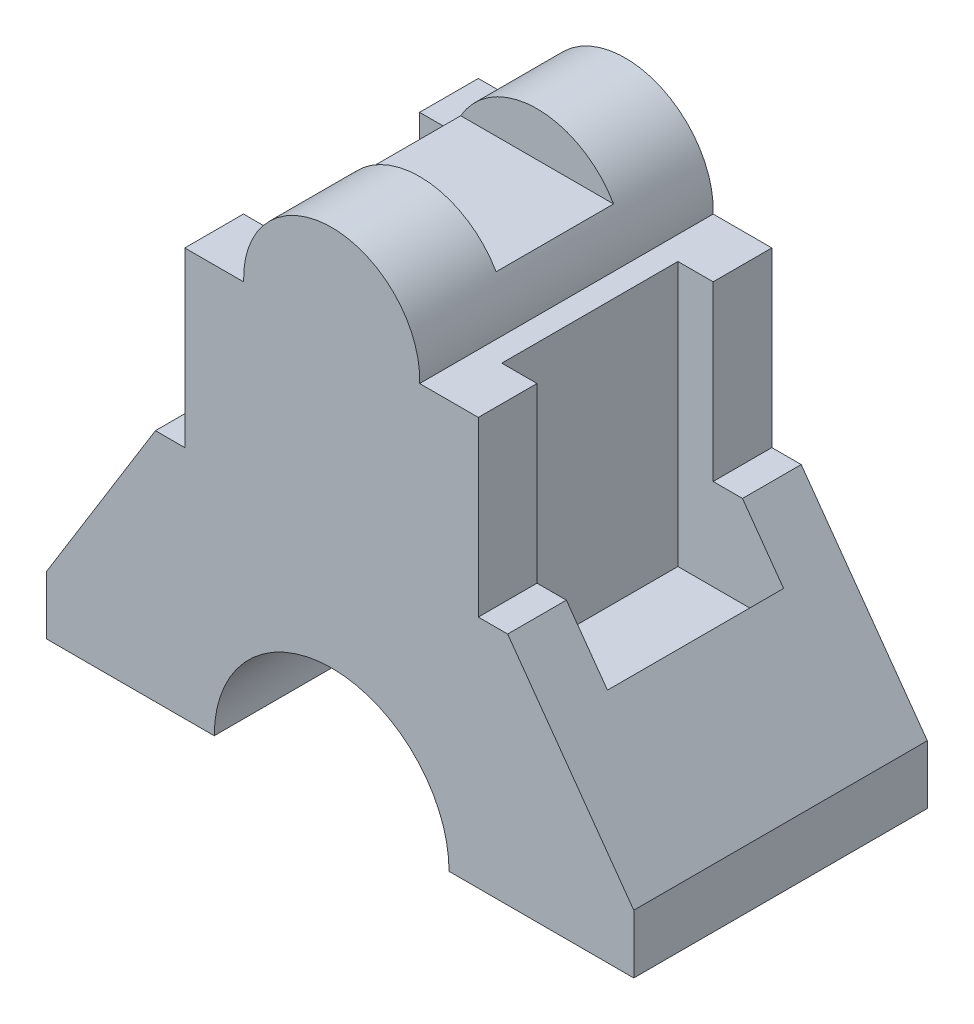
ISO-10303-21;
HEADER;
FILE_DESCRIPTION(('STEP AP214'),'2;1');
FILE_NAME('part.step','',(''),(''),'','','');
FILE_SCHEMA(('AUTOMOTIVE_DESIGN { 1 0 10303 214 1 1 1 1 }'));
ENDSEC;
DATA;
#1=APPLICATION_CONTEXT('core data for automotive mechanical design processes');
#2=APPLICATION_PROTOCOL_DEFINITION('international standard','automotive_design',2000,#1);
#3=PRODUCT_CONTEXT('',#1,'mechanical');
#4=PRODUCT('Part','Part','',(#3));
#5=PRODUCT_RELATED_PRODUCT_CATEGORY('part','',(#4));
#6=PRODUCT_DEFINITION_FORMATION('','',#4);
#7=PRODUCT_DEFINITION_CONTEXT('part definition',#1,'design');
#8=PRODUCT_DEFINITION('design','',#6,#7);
#9=PRODUCT_DEFINITION_SHAPE('','',#8);
#10=(LENGTH_UNIT() NAMED_UNIT(*) SI_UNIT(.MILLI.,.METRE.));
#11=(NAMED_UNIT(*) PLANE_ANGLE_UNIT() SI_UNIT($,.RADIAN.));
#12=(NAMED_UNIT(*) SI_UNIT($,.STERADIAN.) SOLID_ANGLE_UNIT());
#13=UNCERTAINTY_MEASURE_WITH_UNIT(LENGTH_MEASURE(1.E-05),#10,'distance_accuracy_value','');
#14=(GEOMETRIC_REPRESENTATION_CONTEXT(3) GLOBAL_UNCERTAINTY_ASSIGNED_CONTEXT((#13)) GLOBAL_UNIT_ASSIGNED_CONTEXT((#10,
#11,#12)) REPRESENTATION_CONTEXT('',''));
#15=CARTESIAN_POINT('',(0.,0.,0.));
#16=DIRECTION('',(0.,0.,1.));
#17=DIRECTION('',(1.,0.,0.));
#18=AXIS2_PLACEMENT_3D('',#15,#16,#17);
#19=CARTESIAN_POINT('',(-15.7546590651352,70.,25.));
#20=DIRECTION('',(0.,0.,-1.));
#21=DIRECTION('',(-1.,0.,0.));
#22=AXIS2_PLACEMENT_3D('',#19,#20,#21);
#23=CYLINDRICAL_SURFACE('',#22,15.);
#24=CARTESIAN_POINT('',(-15.7546590651352,70.,-25.));
#25=DIRECTION('',(0.,0.,1.));
#26=DIRECTION('',(1.,0.,0.));
#27=AXIS2_PLACEMENT_3D('',#24,#25,#26);
#28=CIRCLE('',#27,15.);
#29=CARTESIAN_POINT('',(-0.764451303788573,69.4580855494971,-25.));
#30=VERTEX_POINT('',#29);
#31=CARTESIAN_POINT('',(-30.7448668264818,69.4580855494971,-25.));
#32=VERTEX_POINT('',#31);
#33=EDGE_CURVE('E384',#30,#32,#28,.T.);
#34=ORIENTED_EDGE('',*,*,#33,.T.);
#35=DIRECTION('',(0.,0.,-1.));
#36=VECTOR('',#35,1.);
#37=CARTESIAN_POINT('',(-30.7448668264818,69.4580855494971,25.));
#38=LINE('',#37,#36);
#39=CARTESIAN_POINT('',(-30.7448668264818,69.4580855494971,25.));
#40=VERTEX_POINT('',#39);
#41=EDGE_CURVE('E283',#40,#32,#38,.T.);
#42=ORIENTED_EDGE('',*,*,#41,.F.);
#43=CARTESIAN_POINT('',(-15.7546590651352,70.,25.));
#44=DIRECTION('',(0.,0.,1.));
#45=DIRECTION('',(1.,0.,0.));
#46=AXIS2_PLACEMENT_3D('',#43,#44,#45);
#47=CIRCLE('',#46,15.);
#48=CARTESIAN_POINT('',(-0.764451303788573,69.4580855494971,25.));
#49=VERTEX_POINT('',#48);
#50=EDGE_CURVE('E434',#49,#40,#47,.T.);
#51=ORIENTED_EDGE('',*,*,#50,.F.);
#52=DIRECTION('',(0.,0.,-1.));
#53=VECTOR('',#52,1.);
#54=CARTESIAN_POINT('',(-0.764451303788573,69.4580855494971,25.));
#55=LINE('',#54,#53);
#56=EDGE_CURVE('E279',#49,#30,#55,.T.);
#57=ORIENTED_EDGE('',*,*,#56,.T.);
#58=EDGE_LOOP('',(#34,#42,#51,#57));
#59=FACE_BOUND('',#58,.T.);
#60=DIRECTION('',(0.,0.,-1.));
#61=VECTOR('',#60,1.);
#62=CARTESIAN_POINT('',(-2.74016868185923,77.4580855494971,25.));
#63=LINE('',#62,#61);
#64=CARTESIAN_POINT('',(-2.74016868185923,77.4580855494971,10.));
#65=VERTEX_POINT('',#64);
#66=CARTESIAN_POINT('',(-2.74016868185923,77.4580855494971,-10.));
#67=VERTEX_POINT('',#66);
#68=EDGE_CURVE('E11',#65,#67,#63,.T.);
#69=ORIENTED_EDGE('',*,*,#68,.F.);
#70=CARTESIAN_POINT('',(-15.7546590651352,70.,10.));
#71=DIRECTION('',(0.,0.,1.));
#72=DIRECTION('',(1.,0.,0.));
#73=AXIS2_PLACEMENT_3D('',#70,#71,#72);
#74=CIRCLE('',#73,15.);
#75=CARTESIAN_POINT('',(-28.7691494484111,77.4580855494971,10.));
#76=VERTEX_POINT('',#75);
#77=EDGE_CURVE('E50',#65,#76,#74,.T.);
#78=ORIENTED_EDGE('',*,*,#77,.T.);
#79=DIRECTION('',(0.,0.,-1.));
#80=VECTOR('',#79,1.);
#81=CARTESIAN_POINT('',(-28.7691494484111,77.4580855494971,25.));
#82=LINE('',#81,#80);
#83=CARTESIAN_POINT('',(-28.7691494484111,77.4580855494971,-10.));
#84=VERTEX_POINT('',#83);
#85=EDGE_CURVE('E237',#84,#76,#82,.F.);
#86=ORIENTED_EDGE('',*,*,#85,.F.);
#87=CARTESIAN_POINT('',(-15.7546590651352,70.,-10.));
#88=DIRECTION('',(0.,0.,-1.));
#89=DIRECTION('',(-1.,0.,0.));
#90=AXIS2_PLACEMENT_3D('',#87,#88,#89);
#91=CIRCLE('',#90,15.);
#92=EDGE_CURVE('E246',#84,#67,#91,.T.);
#93=ORIENTED_EDGE('',*,*,#92,.T.);
#94=EDGE_LOOP('',(#69,#78,#86,#93));
#95=FACE_BOUND('',#94,.T.);
#96=ADVANCED_FACE('F41',(#59,#95),#23,.T.);
#97=CARTESIAN_POINT('',(-40.7741454788537,0.,25.));
#98=DIRECTION('',(-1.,0.,0.));
#99=DIRECTION('',(0.,0.,1.));
#100=AXIS2_PLACEMENT_3D('',#97,#98,#99);
#101=PLANE('',#100);
#102=DIRECTION('',(0.,0.,-1.));
#103=VECTOR('',#102,1.);
#104=CARTESIAN_POINT('',(-40.7741454788537,40.,25.));
#105=LINE('',#104,#103);
#106=CARTESIAN_POINT('',(-40.7741454788537,40.,-15.));
#107=VERTEX_POINT('',#106);
#108=CARTESIAN_POINT('',(-40.7741454788537,40.,-25.));
#109=VERTEX_POINT('',#108);
#110=EDGE_CURVE('E296',#107,#109,#105,.T.);
#111=ORIENTED_EDGE('',*,*,#110,.F.);
#112=DIRECTION('',(0.,1.,0.));
#113=VECTOR('',#112,1.);
#114=CARTESIAN_POINT('',(-40.7741454788537,0.,-15.));
#115=LINE('',#114,#113);
#116=CARTESIAN_POINT('',(-40.7741454788537,69.4580855494971,-15.));
#117=VERTEX_POINT('',#116);
#118=EDGE_CURVE('E499',#107,#117,#115,.T.);
#119=ORIENTED_EDGE('',*,*,#118,.T.);
#120=DIRECTION('',(0.,0.,-1.));
#121=VECTOR('',#120,1.);
#122=CARTESIAN_POINT('',(-40.7741454788537,69.4580855494971,25.));
#123=LINE('',#122,#121);
#124=CARTESIAN_POINT('',(-40.7741454788537,69.4580855494971,-25.));
#125=VERTEX_POINT('',#124);
#126=EDGE_CURVE('E291',#117,#125,#123,.T.);
#127=ORIENTED_EDGE('',*,*,#126,.T.);
#128=DIRECTION('',(0.,1.,0.));
#129=VECTOR('',#128,1.);
#130=CARTESIAN_POINT('',(-40.7741454788537,0.,-25.));
#131=LINE('',#130,#129);
#132=EDGE_CURVE('E376',#109,#125,#131,.T.);
#133=ORIENTED_EDGE('',*,*,#132,.F.);
#134=EDGE_LOOP('',(#111,#119,#127,#133));
#135=FACE_BOUND('',#134,.T.);
#136=ADVANCED_FACE('F556',(#135),#101,.T.);
#137=CARTESIAN_POINT('',(0.,40.,25.));
#138=DIRECTION('',(0.,-1.,0.));
#139=DIRECTION('',(0.,0.,-1.));
#140=AXIS2_PLACEMENT_3D('',#137,#138,#139);
#141=PLANE('',#140);
#142=DIRECTION('',(-1.,0.,0.));
#143=VECTOR('',#142,1.);
#144=CARTESIAN_POINT('',(0.,40.,-15.));
#145=LINE('',#144,#143);
#146=CARTESIAN_POINT('',(-45.7741454788537,40.,-15.));
#147=VERTEX_POINT('',#146);
#148=EDGE_CURVE('E64',#107,#147,#145,.T.);
#149=ORIENTED_EDGE('',*,*,#148,.F.);
#150=ORIENTED_EDGE('',*,*,#110,.T.);
#151=DIRECTION('',(-1.,0.,0.));
#152=VECTOR('',#151,1.);
#153=CARTESIAN_POINT('',(0.,40.,-25.));
#154=LINE('',#153,#152);
#155=CARTESIAN_POINT('',(-45.7741454788537,40.,-25.));
#156=VERTEX_POINT('',#155);
#157=EDGE_CURVE('E372',#109,#156,#154,.T.);
#158=ORIENTED_EDGE('',*,*,#157,.T.);
#159=DIRECTION('',(0.,0.,-1.));
#160=VECTOR('',#159,1.);
#161=CARTESIAN_POINT('',(-45.7741454788537,40.,25.));
#162=LINE('',#161,#160);
#163=EDGE_CURVE('E301',#147,#156,#162,.T.);
#164=ORIENTED_EDGE('',*,*,#163,.F.);
#165=EDGE_LOOP('',(#149,#150,#158,#164));
#166=FACE_BOUND('',#165,.T.);
#167=ADVANCED_FACE('F570',(#166),#141,.F.);
#168=CARTESIAN_POINT('',(0.,40.,25.));
#169=DIRECTION('',(0.,-1.,0.));
#170=DIRECTION('',(0.,0.,-1.));
#171=AXIS2_PLACEMENT_3D('',#168,#169,#170);
#172=PLANE('',#171);
#173=DIRECTION('',(1.,0.,0.));
#174=VECTOR('',#173,1.);
#175=CARTESIAN_POINT('',(0.,40.,15.));
#176=LINE('',#175,#174);
#177=CARTESIAN_POINT('',(9.22585452114633,40.,15.));
#178=VERTEX_POINT('',#177);
#179=CARTESIAN_POINT('',(14.2258545211463,40.,15.));
#180=VERTEX_POINT('',#179);
#181=EDGE_CURVE('E450',#178,#180,#176,.T.);
#182=ORIENTED_EDGE('',*,*,#181,.F.);
#183=DIRECTION('',(0.,0.,-1.));
#184=VECTOR('',#183,1.);
#185=CARTESIAN_POINT('',(9.22585452114633,40.,25.));
#186=LINE('',#185,#184);
#187=CARTESIAN_POINT('',(9.22585452114633,40.,25.));
#188=VERTEX_POINT('',#187);
#189=EDGE_CURVE('E325',#188,#178,#186,.T.);
#190=ORIENTED_EDGE('',*,*,#189,.F.);
#191=DIRECTION('',(-1.,0.,0.));
#192=VECTOR('',#191,1.);
#193=CARTESIAN_POINT('',(0.,40.,25.));
#194=LINE('',#193,#192);
#195=CARTESIAN_POINT('',(14.2258545211463,40.,25.));
#196=VERTEX_POINT('',#195);
#197=EDGE_CURVE('E395',#196,#188,#194,.T.);
#198=ORIENTED_EDGE('',*,*,#197,.F.);
#199=DIRECTION('',(0.,0.,-1.));
#200=VECTOR('',#199,1.);
#201=CARTESIAN_POINT('',(14.2258545211463,40.,25.));
#202=LINE('',#201,#200);
#203=EDGE_CURVE('E320',#196,#180,#202,.T.);
#204=ORIENTED_EDGE('',*,*,#203,.T.);
#205=EDGE_LOOP('',(#182,#190,#198,#204));
#206=FACE_BOUND('',#205,.T.);
#207=ADVANCED_FACE('F645',(#206),#172,.F.);
#208=CARTESIAN_POINT('',(9.22585452114633,0.,25.));
#209=DIRECTION('',(-1.,0.,0.));
#210=DIRECTION('',(0.,0.,1.));
#211=AXIS2_PLACEMENT_3D('',#208,#209,#210);
#212=PLANE('',#211);
#213=DIRECTION('',(0.,-1.,0.));
#214=VECTOR('',#213,1.);
#215=CARTESIAN_POINT('',(9.22585452114633,0.,15.));
#216=LINE('',#215,#214);
#217=CARTESIAN_POINT('',(9.22585452114633,69.4580855494971,15.));
#218=VERTEX_POINT('',#217);
#219=EDGE_CURVE('E276',#218,#178,#216,.T.);
#220=ORIENTED_EDGE('',*,*,#219,.F.);
#221=DIRECTION('',(0.,0.,-1.));
#222=VECTOR('',#221,1.);
#223=CARTESIAN_POINT('',(9.22585452114633,69.4580855494971,25.));
#224=LINE('',#223,#222);
#225=CARTESIAN_POINT('',(9.22585452114633,69.4580855494971,25.));
#226=VERTEX_POINT('',#225);
#227=EDGE_CURVE('E330',#226,#218,#224,.T.);
#228=ORIENTED_EDGE('',*,*,#227,.F.);
#229=DIRECTION('',(0.,1.,0.));
#230=VECTOR('',#229,1.);
#231=CARTESIAN_POINT('',(9.22585452114633,0.,25.));
#232=LINE('',#231,#230);
#233=EDGE_CURVE('E392',#188,#226,#232,.T.);
#234=ORIENTED_EDGE('',*,*,#233,.F.);
#235=ORIENTED_EDGE('',*,*,#189,.T.);
#236=EDGE_LOOP('',(#220,#228,#234,#235));
#237=FACE_BOUND('',#236,.T.);
#238=ADVANCED_FACE('F648',(#237),#212,.F.);
#239=CARTESIAN_POINT('',(0.,69.4580855494971,25.));
#240=DIRECTION('',(0.,-1.,0.));
#241=DIRECTION('',(0.,0.,-1.));
#242=AXIS2_PLACEMENT_3D('',#239,#240,#241);
#243=PLANE('',#242);
#244=DIRECTION('',(0.,0.,-1.));
#245=VECTOR('',#244,1.);
#246=CARTESIAN_POINT('',(3.22585452114633,69.4580855494971,0.));
#247=LINE('',#246,#245);
#248=CARTESIAN_POINT('',(3.22585452114633,69.4580855494971,15.));
#249=VERTEX_POINT('',#248);
#250=CARTESIAN_POINT('',(3.22585452114633,69.4580855494971,-15.));
#251=VERTEX_POINT('',#250);
#252=EDGE_CURVE('E477',#249,#251,#247,.T.);
#253=ORIENTED_EDGE('',*,*,#252,.T.);
#254=DIRECTION('',(-1.,0.,0.));
#255=VECTOR('',#254,1.);
#256=CARTESIAN_POINT('',(0.,69.4580855494971,-15.));
#257=LINE('',#256,#255);
#258=CARTESIAN_POINT('',(9.22585452114633,69.4580855494971,-15.));
#259=VERTEX_POINT('',#258);
#260=EDGE_CURVE('E469',#259,#251,#257,.T.);
#261=ORIENTED_EDGE('',*,*,#260,.F.);
#262=CARTESIAN_POINT('',(9.22585452114633,69.4580855494971,-25.));
#263=VERTEX_POINT('',#262);
#264=EDGE_CURVE('E334',#259,#263,#224,.T.);
#265=ORIENTED_EDGE('',*,*,#264,.T.);
#266=DIRECTION('',(-1.,0.,0.));
#267=VECTOR('',#266,1.);
#268=CARTESIAN_POINT('',(0.,69.4580855494971,-25.));
#269=LINE('',#268,#267);
#270=EDGE_CURVE('E387',#263,#30,#269,.T.);
#271=ORIENTED_EDGE('',*,*,#270,.T.);
#272=ORIENTED_EDGE('',*,*,#56,.F.);
#273=DIRECTION('',(-1.,0.,0.));
#274=VECTOR('',#273,1.);
#275=CARTESIAN_POINT('',(0.,69.4580855494971,25.));
#276=LINE('',#275,#274);
#277=EDGE_CURVE('E339',#226,#49,#276,.T.);
#278=ORIENTED_EDGE('',*,*,#277,.F.);
#279=ORIENTED_EDGE('',*,*,#227,.T.);
#280=DIRECTION('',(-1.,0.,0.));
#281=VECTOR('',#280,1.);
#282=CARTESIAN_POINT('',(0.,69.4580855494971,15.));
#283=LINE('',#282,#281);
#284=EDGE_CURVE('E473',#218,#249,#283,.T.);
#285=ORIENTED_EDGE('',*,*,#284,.T.);
#286=EDGE_LOOP('',(#253,#261,#265,#271,#272,#278,#279,#285));
#287=FACE_BOUND('',#286,.T.);
#288=ADVANCED_FACE('F43',(#287),#243,.F.);
#289=CARTESIAN_POINT('',(0.,69.4580855494972,25.));
#290=DIRECTION('',(0.,-1.,0.));
#291=DIRECTION('',(1.,0.,0.));
#292=AXIS2_PLACEMENT_3D('',#289,#290,#291);
#293=PLANE('',#292);
#294=DIRECTION('',(0.,0.,-1.));
#295=VECTOR('',#294,1.);
#296=CARTESIAN_POINT('',(-31.8137378821515,69.4580855494971,0.));
#297=LINE('',#296,#295);
#298=CARTESIAN_POINT('',(-31.8137378821515,69.4580855494971,15.));
#299=VERTEX_POINT('',#298);
#300=CARTESIAN_POINT('',(-31.8137378821515,69.4580855494971,-15.));
#301=VERTEX_POINT('',#300);
#302=EDGE_CURVE('E252',#299,#301,#297,.T.);
#303=ORIENTED_EDGE('',*,*,#302,.F.);
#304=DIRECTION('',(1.,0.,0.));
#305=VECTOR('',#304,1.);
#306=CARTESIAN_POINT('',(-28.5878833610051,69.4580855494971,15.));
#307=LINE('',#306,#305);
#308=CARTESIAN_POINT('',(-40.7741454788537,69.4580855494971,15.));
#309=VERTEX_POINT('',#308);
#310=EDGE_CURVE('E521',#309,#299,#307,.T.);
#311=ORIENTED_EDGE('',*,*,#310,.F.);
#312=CARTESIAN_POINT('',(-40.7741454788537,69.4580855494971,25.));
#313=VERTEX_POINT('',#312);
#314=EDGE_CURVE('E287',#313,#309,#123,.T.);
#315=ORIENTED_EDGE('',*,*,#314,.F.);
#316=DIRECTION('',(-1.,0.,0.));
#317=VECTOR('',#316,1.);
#318=CARTESIAN_POINT('',(0.,69.4580855494972,25.));
#319=LINE('',#318,#317);
#320=EDGE_CURVE('E431',#40,#313,#319,.T.);
#321=ORIENTED_EDGE('',*,*,#320,.F.);
#322=ORIENTED_EDGE('',*,*,#41,.T.);
#323=DIRECTION('',(-1.,0.,0.));
#324=VECTOR('',#323,1.);
#325=CARTESIAN_POINT('',(0.,69.4580855494972,-25.));
#326=LINE('',#325,#324);
#327=EDGE_CURVE('E380',#32,#125,#326,.T.);
#328=ORIENTED_EDGE('',*,*,#327,.T.);
#329=ORIENTED_EDGE('',*,*,#126,.F.);
#330=DIRECTION('',(1.,0.,0.));
#331=VECTOR('',#330,1.);
#332=CARTESIAN_POINT('',(-28.5878833610051,69.4580855494971,-15.));
#333=LINE('',#332,#331);
#334=EDGE_CURVE('E525',#117,#301,#333,.T.);
#335=ORIENTED_EDGE('',*,*,#334,.T.);
#336=EDGE_LOOP('',(#303,#311,#315,#321,#322,#328,#329,#335));
#337=FACE_BOUND('',#336,.T.);
#338=ADVANCED_FACE('F560',(#337),#293,.F.);
#339=DIRECTION('',(0.,1.,0.));
#340=VECTOR('',#339,1.);
#341=CARTESIAN_POINT('',(-40.7741454788537,0.,15.));
#342=LINE('',#341,#340);
#343=CARTESIAN_POINT('',(-40.7741454788537,40.,15.));
#344=VERTEX_POINT('',#343);
#345=EDGE_CURVE('E481',#344,#309,#342,.T.);
#346=ORIENTED_EDGE('',*,*,#345,.F.);
#347=CARTESIAN_POINT('',(-40.7741454788537,40.,25.));
#348=VERTEX_POINT('',#347);
#349=EDGE_CURVE('E292',#348,#344,#105,.T.);
#350=ORIENTED_EDGE('',*,*,#349,.F.);
#351=DIRECTION('',(0.,1.,0.));
#352=VECTOR('',#351,1.);
#353=CARTESIAN_POINT('',(-40.7741454788537,0.,25.));
#354=LINE('',#353,#352);
#355=EDGE_CURVE('E427',#348,#313,#354,.T.);
#356=ORIENTED_EDGE('',*,*,#355,.T.);
#357=ORIENTED_EDGE('',*,*,#314,.T.);
#358=EDGE_LOOP('',(#346,#350,#356,#357));
#359=FACE_BOUND('',#358,.T.);
#360=ADVANCED_FACE('F592',(#359),#101,.T.);
#361=ORIENTED_EDGE('',*,*,#349,.T.);
#362=DIRECTION('',(-1.,0.,0.));
#363=VECTOR('',#362,1.);
#364=CARTESIAN_POINT('',(0.,40.,15.));
#365=LINE('',#364,#363);
#366=CARTESIAN_POINT('',(-45.7741454788537,40.,15.));
#367=VERTEX_POINT('',#366);
#368=EDGE_CURVE('E495',#344,#367,#365,.T.);
#369=ORIENTED_EDGE('',*,*,#368,.T.);
#370=CARTESIAN_POINT('',(-45.7741454788537,40.,25.));
#371=VERTEX_POINT('',#370);
#372=EDGE_CURVE('E297',#371,#367,#162,.T.);
#373=ORIENTED_EDGE('',*,*,#372,.F.);
#374=DIRECTION('',(-1.,0.,0.));
#375=VECTOR('',#374,1.);
#376=CARTESIAN_POINT('',(0.,40.,25.));
#377=LINE('',#376,#375);
#378=EDGE_CURVE('E424',#348,#371,#377,.T.);
#379=ORIENTED_EDGE('',*,*,#378,.F.);
#380=EDGE_LOOP('',(#361,#369,#373,#379));
#381=FACE_BOUND('',#380,.T.);
#382=ADVANCED_FACE('F684',(#381),#141,.F.);
#383=CARTESIAN_POINT('',(-51.0228168506389,31.4977389902629,25.));
#384=DIRECTION('',(0.850919911437673,-0.525295444791694,0.));
#385=DIRECTION('',(0.525295444791694,0.850919911437673,0.));
#386=AXIS2_PLACEMENT_3D('',#383,#384,#385);
#387=PLANE('',#386);
#388=ORIENTED_EDGE('',*,*,#372,.T.);
#389=DIRECTION('',(-0.525295444791694,-0.850919911437673,0.));
#390=VECTOR('',#389,1.);
#391=CARTESIAN_POINT('',(-51.0228168506389,31.4977389902629,15.));
#392=LINE('',#391,#390);
#393=CARTESIAN_POINT('',(-49.8137378821514,33.4563117876997,15.));
#394=VERTEX_POINT('',#393);
#395=EDGE_CURVE('E247',#367,#394,#392,.T.);
#396=ORIENTED_EDGE('',*,*,#395,.T.);
#397=DIRECTION('',(0.,0.,-1.));
#398=VECTOR('',#397,1.);
#399=CARTESIAN_POINT('',(-49.8137378821514,33.4563117876997,25.));
#400=LINE('',#399,#398);
#401=CARTESIAN_POINT('',(-49.8137378821514,33.4563117876997,-15.));
#402=VERTEX_POINT('',#401);
#403=EDGE_CURVE('E261',#394,#402,#400,.T.);
#404=ORIENTED_EDGE('',*,*,#403,.T.);
#405=DIRECTION('',(-0.525295444791694,-0.850919911437673,0.));
#406=VECTOR('',#405,1.);
#407=CARTESIAN_POINT('',(-51.0228168506389,31.497738990263,-15.));
#408=LINE('',#407,#406);
#409=EDGE_CURVE('E265',#147,#402,#408,.T.);
#410=ORIENTED_EDGE('',*,*,#409,.F.);
#411=ORIENTED_EDGE('',*,*,#163,.T.);
#412=DIRECTION('',(-0.525295444791694,-0.850919911437673,0.));
#413=VECTOR('',#412,1.);
#414=CARTESIAN_POINT('',(-51.0228168506389,31.4977389902629,-25.));
#415=LINE('',#414,#413);
#416=CARTESIAN_POINT('',(-64.2939416805026,10.,-25.));
#417=VERTEX_POINT('',#416);
#418=EDGE_CURVE('E368',#156,#417,#415,.T.);
#419=ORIENTED_EDGE('',*,*,#418,.T.);
#420=DIRECTION('',(0.,0.,-1.));
#421=VECTOR('',#420,1.);
#422=CARTESIAN_POINT('',(-64.2939416805026,10.,25.));
#423=LINE('',#422,#421);
#424=CARTESIAN_POINT('',(-64.2939416805026,10.,25.));
#425=VERTEX_POINT('',#424);
#426=EDGE_CURVE('E302',#425,#417,#423,.T.);
#427=ORIENTED_EDGE('',*,*,#426,.F.);
#428=DIRECTION('',(-0.525295444791694,-0.850919911437673,0.));
#429=VECTOR('',#428,1.);
#430=CARTESIAN_POINT('',(-51.0228168506389,31.4977389902629,25.));
#431=LINE('',#430,#429);
#432=EDGE_CURVE('E421',#371,#425,#431,.T.);
#433=ORIENTED_EDGE('',*,*,#432,.F.);
#434=EDGE_LOOP('',(#388,#396,#404,#410,#411,#419,#427,#433));
#435=FACE_BOUND('',#434,.T.);
#436=ADVANCED_FACE('F572',(#435),#387,.F.);
#437=CARTESIAN_POINT('',(-64.2939416805026,0.,25.));
#438=DIRECTION('',(-1.,0.,0.));
#439=DIRECTION('',(0.,0.,1.));
#440=AXIS2_PLACEMENT_3D('',#437,#438,#439);
#441=PLANE('',#440);
#442=DIRECTION('',(0.,1.,0.));
#443=VECTOR('',#442,1.);
#444=CARTESIAN_POINT('',(-64.2939416805026,0.,-25.));
#445=LINE('',#444,#443);
#446=CARTESIAN_POINT('',(-64.2939416805026,0.,-25.));
#447=VERTEX_POINT('',#446);
#448=EDGE_CURVE('E364',#447,#417,#445,.T.);
#449=ORIENTED_EDGE('',*,*,#448,.F.);
#450=DIRECTION('',(0.,0.,-1.));
#451=VECTOR('',#450,1.);
#452=CARTESIAN_POINT('',(-64.2939416805026,0.,25.));
#453=LINE('',#452,#451);
#454=CARTESIAN_POINT('',(-64.2939416805026,0.,25.));
#455=VERTEX_POINT('',#454);
#456=EDGE_CURVE('E305',#455,#447,#453,.T.);
#457=ORIENTED_EDGE('',*,*,#456,.F.);
#458=DIRECTION('',(0.,1.,0.));
#459=VECTOR('',#458,1.);
#460=CARTESIAN_POINT('',(-64.2939416805026,0.,25.));
#461=LINE('',#460,#459);
#462=EDGE_CURVE('E417',#455,#425,#461,.T.);
#463=ORIENTED_EDGE('',*,*,#462,.T.);
#464=ORIENTED_EDGE('',*,*,#426,.T.);
#465=EDGE_LOOP('',(#449,#457,#463,#464));
#466=FACE_BOUND('',#465,.T.);
#467=ADVANCED_FACE('F637',(#466),#441,.T.);
#468=CARTESIAN_POINT('',(0.,0.,25.));
#469=DIRECTION('',(0.,-1.,0.));
#470=DIRECTION('',(1.,0.,0.));
#471=AXIS2_PLACEMENT_3D('',#468,#469,#470);
#472=PLANE('',#471);
#473=DIRECTION('',(-1.,0.,0.));
#474=VECTOR('',#473,1.);
#475=CARTESIAN_POINT('',(0.,0.,-25.));
#476=LINE('',#475,#474);
#477=CARTESIAN_POINT('',(-35.7546590651352,0.,-25.));
#478=VERTEX_POINT('',#477);
#479=EDGE_CURVE('E360',#478,#447,#476,.T.);
#480=ORIENTED_EDGE('',*,*,#479,.F.);
#481=DIRECTION('',(0.,0.,-1.));
#482=VECTOR('',#481,1.);
#483=CARTESIAN_POINT('',(-35.7546590651352,0.,25.));
#484=LINE('',#483,#482);
#485=CARTESIAN_POINT('',(-35.7546590651352,0.,25.));
#486=VERTEX_POINT('',#485);
#487=EDGE_CURVE('E308',#486,#478,#484,.T.);
#488=ORIENTED_EDGE('',*,*,#487,.F.);
#489=DIRECTION('',(-1.,0.,0.));
#490=VECTOR('',#489,1.);
#491=CARTESIAN_POINT('',(0.,0.,25.));
#492=LINE('',#491,#490);
#493=EDGE_CURVE('E413',#486,#455,#492,.T.);
#494=ORIENTED_EDGE('',*,*,#493,.T.);
#495=ORIENTED_EDGE('',*,*,#456,.T.);
#496=EDGE_LOOP('',(#480,#488,#494,#495));
#497=FACE_BOUND('',#496,.T.);
#498=ADVANCED_FACE('F633',(#497),#472,.T.);
#499=CARTESIAN_POINT('',(-15.7546590651352,0.,25.));
#500=DIRECTION('',(0.,0.,-1.));
#501=DIRECTION('',(-1.,0.,0.));
#502=AXIS2_PLACEMENT_3D('',#499,#500,#501);
#503=CYLINDRICAL_SURFACE('',#502,20.);
#504=CARTESIAN_POINT('',(-15.7546590651352,0.,-25.));
#505=DIRECTION('',(0.,0.,1.));
#506=DIRECTION('',(1.,0.,0.));
#507=AXIS2_PLACEMENT_3D('',#504,#505,#506);
#508=CIRCLE('',#507,20.);
#509=CARTESIAN_POINT('',(4.24534093486482,0.,-25.));
#510=VERTEX_POINT('',#509);
#511=EDGE_CURVE('E356',#510,#478,#508,.T.);
#512=ORIENTED_EDGE('',*,*,#511,.F.);
#513=DIRECTION('',(0.,0.,-1.));
#514=VECTOR('',#513,1.);
#515=CARTESIAN_POINT('',(4.24534093486482,0.,25.));
#516=LINE('',#515,#514);
#517=CARTESIAN_POINT('',(4.24534093486482,0.,25.));
#518=VERTEX_POINT('',#517);
#519=EDGE_CURVE('E311',#518,#510,#516,.T.);
#520=ORIENTED_EDGE('',*,*,#519,.F.);
#521=CARTESIAN_POINT('',(-15.7546590651352,0.,25.));
#522=DIRECTION('',(0.,0.,1.));
#523=DIRECTION('',(1.,0.,0.));
#524=AXIS2_PLACEMENT_3D('',#521,#522,#523);
#525=CIRCLE('',#524,20.);
#526=EDGE_CURVE('E409',#518,#486,#525,.T.);
#527=ORIENTED_EDGE('',*,*,#526,.T.);
#528=ORIENTED_EDGE('',*,*,#487,.T.);
#529=EDGE_LOOP('',(#512,#520,#527,#528));
#530=FACE_BOUND('',#529,.T.);
#531=ADVANCED_FACE('F629',(#530),#503,.F.);
#532=CARTESIAN_POINT('',(0.,0.,25.));
#533=DIRECTION('',(0.,-1.,0.));
#534=DIRECTION('',(1.,0.,0.));
#535=AXIS2_PLACEMENT_3D('',#532,#533,#534);
#536=PLANE('',#535);
#537=DIRECTION('',(-1.,0.,0.));
#538=VECTOR('',#537,1.);
#539=CARTESIAN_POINT('',(0.,0.,-25.));
#540=LINE('',#539,#538);
#541=CARTESIAN_POINT('',(35.7060583194974,0.,-25.));
#542=VERTEX_POINT('',#541);
#543=EDGE_CURVE('E352',#542,#510,#540,.T.);
#544=ORIENTED_EDGE('',*,*,#543,.F.);
#545=DIRECTION('',(0.,0.,-1.));
#546=VECTOR('',#545,1.);
#547=CARTESIAN_POINT('',(35.7060583194974,0.,25.));
#548=LINE('',#547,#546);
#549=CARTESIAN_POINT('',(35.7060583194974,0.,25.));
#550=VERTEX_POINT('',#549);
#551=EDGE_CURVE('E314',#550,#542,#548,.T.);
#552=ORIENTED_EDGE('',*,*,#551,.F.);
#553=DIRECTION('',(-1.,0.,0.));
#554=VECTOR('',#553,1.);
#555=CARTESIAN_POINT('',(0.,0.,25.));
#556=LINE('',#555,#554);
#557=EDGE_CURVE('E405',#550,#518,#556,.T.);
#558=ORIENTED_EDGE('',*,*,#557,.T.);
#559=ORIENTED_EDGE('',*,*,#519,.T.);
#560=EDGE_LOOP('',(#544,#552,#558,#559));
#561=FACE_BOUND('',#560,.T.);
#562=ADVANCED_FACE('F624',(#561),#536,.T.);
#563=CARTESIAN_POINT('',(35.7060583194974,0.,25.));
#564=DIRECTION('',(-1.,0.,0.));
#565=DIRECTION('',(0.,0.,1.));
#566=AXIS2_PLACEMENT_3D('',#563,#564,#565);
#567=PLANE('',#566);
#568=DIRECTION('',(0.,1.,0.));
#569=VECTOR('',#568,1.);
#570=CARTESIAN_POINT('',(35.7060583194974,0.,-25.));
#571=LINE('',#570,#569);
#572=CARTESIAN_POINT('',(35.7060583194975,10.,-25.));
#573=VERTEX_POINT('',#572);
#574=EDGE_CURVE('E348',#542,#573,#571,.T.);
#575=ORIENTED_EDGE('',*,*,#574,.T.);
#576=DIRECTION('',(0.,0.,-1.));
#577=VECTOR('',#576,1.);
#578=CARTESIAN_POINT('',(35.7060583194975,10.,25.));
#579=LINE('',#578,#577);
#580=CARTESIAN_POINT('',(35.7060583194975,10.,25.));
#581=VERTEX_POINT('',#580);
#582=EDGE_CURVE('E317',#581,#573,#579,.T.);
#583=ORIENTED_EDGE('',*,*,#582,.F.);
#584=DIRECTION('',(0.,1.,0.));
#585=VECTOR('',#584,1.);
#586=CARTESIAN_POINT('',(35.7060583194974,0.,25.));
#587=LINE('',#586,#585);
#588=EDGE_CURVE('E402',#550,#581,#587,.T.);
#589=ORIENTED_EDGE('',*,*,#588,.F.);
#590=ORIENTED_EDGE('',*,*,#551,.T.);
#591=EDGE_LOOP('',(#575,#583,#589,#590));
#592=FACE_BOUND('',#591,.T.);
#593=ADVANCED_FACE('F621',(#592),#567,.F.);
#594=CARTESIAN_POINT('',(28.3381354242544,20.2902974726086,25.));
#595=DIRECTION('',(0.813071084389811,0.582164419841316,0.));
#596=DIRECTION('',(-0.582164419841316,0.813071084389811,0.));
#597=AXIS2_PLACEMENT_3D('',#594,#595,#596);
#598=PLANE('',#597);
#599=DIRECTION('',(-0.582164419841316,0.813071084389811,0.));
#600=VECTOR('',#599,1.);
#601=CARTESIAN_POINT('',(28.3381354242544,20.2902974726086,-15.));
#602=LINE('',#601,#600);
#603=CARTESIAN_POINT('',(21.2258545211463,30.2235564442773,-15.));
#604=VERTEX_POINT('',#603);
#605=CARTESIAN_POINT('',(14.2258545211463,40.,-15.));
#606=VERTEX_POINT('',#605);
#607=EDGE_CURVE('E391',#604,#606,#602,.T.);
#608=ORIENTED_EDGE('',*,*,#607,.F.);
#609=DIRECTION('',(0.,0.,1.));
#610=VECTOR('',#609,1.);
#611=CARTESIAN_POINT('',(21.2258545211463,30.2235564442773,25.));
#612=LINE('',#611,#610);
#613=CARTESIAN_POINT('',(21.2258545211463,30.2235564442773,15.));
#614=VERTEX_POINT('',#613);
#615=EDGE_CURVE('E268',#604,#614,#612,.T.);
#616=ORIENTED_EDGE('',*,*,#615,.T.);
#617=DIRECTION('',(-0.582164419841316,0.813071084389811,0.));
#618=VECTOR('',#617,1.);
#619=CARTESIAN_POINT('',(28.3381354242544,20.2902974726086,15.));
#620=LINE('',#619,#618);
#621=EDGE_CURVE('E446',#614,#180,#620,.T.);
#622=ORIENTED_EDGE('',*,*,#621,.T.);
#623=ORIENTED_EDGE('',*,*,#203,.F.);
#624=DIRECTION('',(0.582164419841316,-0.813071084389811,0.));
#625=VECTOR('',#624,1.);
#626=CARTESIAN_POINT('',(28.3381354242544,20.2902974726086,25.));
#627=LINE('',#626,#625);
#628=EDGE_CURVE('E398',#196,#581,#627,.T.);
#629=ORIENTED_EDGE('',*,*,#628,.T.);
#630=ORIENTED_EDGE('',*,*,#582,.T.);
#631=DIRECTION('',(0.582164419841316,-0.813071084389811,0.));
#632=VECTOR('',#631,1.);
#633=CARTESIAN_POINT('',(28.3381354242544,20.2902974726086,-25.));
#634=LINE('',#633,#632);
#635=CARTESIAN_POINT('',(14.2258545211463,40.,-25.));
#636=VERTEX_POINT('',#635);
#637=EDGE_CURVE('E344',#636,#573,#634,.T.);
#638=ORIENTED_EDGE('',*,*,#637,.F.);
#639=EDGE_CURVE('E324',#606,#636,#202,.T.);
#640=ORIENTED_EDGE('',*,*,#639,.F.);
#641=EDGE_LOOP('',(#608,#616,#622,#623,#629,#630,#638,#640));
#642=FACE_BOUND('',#641,.T.);
#643=ADVANCED_FACE('F616',(#642),#598,.T.);
#644=CARTESIAN_POINT('',(9.22585452114633,40.,-15.));
#645=VERTEX_POINT('',#644);
#646=CARTESIAN_POINT('',(9.22585452114633,40.,-25.));
#647=VERTEX_POINT('',#646);
#648=EDGE_CURVE('E329',#645,#647,#186,.T.);
#649=ORIENTED_EDGE('',*,*,#648,.F.);
#650=DIRECTION('',(1.,0.,0.));
#651=VECTOR('',#650,1.);
#652=CARTESIAN_POINT('',(0.,40.,-15.));
#653=LINE('',#652,#651);
#654=EDGE_CURVE('E442',#645,#606,#653,.T.);
#655=ORIENTED_EDGE('',*,*,#654,.T.);
#656=ORIENTED_EDGE('',*,*,#639,.T.);
#657=DIRECTION('',(-1.,0.,0.));
#658=VECTOR('',#657,1.);
#659=CARTESIAN_POINT('',(0.,40.,-25.));
#660=LINE('',#659,#658);
#661=EDGE_CURVE('E340',#636,#647,#660,.T.);
#662=ORIENTED_EDGE('',*,*,#661,.T.);
#663=EDGE_LOOP('',(#649,#655,#656,#662));
#664=FACE_BOUND('',#663,.T.);
#665=ADVANCED_FACE('F610',(#664),#172,.F.);
#666=ORIENTED_EDGE('',*,*,#264,.F.);
#667=DIRECTION('',(0.,-1.,0.));
#668=VECTOR('',#667,1.);
#669=CARTESIAN_POINT('',(9.22585452114633,0.,-15.));
#670=LINE('',#669,#668);
#671=EDGE_CURVE('E272',#259,#645,#670,.T.);
#672=ORIENTED_EDGE('',*,*,#671,.T.);
#673=ORIENTED_EDGE('',*,*,#648,.T.);
#674=DIRECTION('',(0.,1.,0.));
#675=VECTOR('',#674,1.);
#676=CARTESIAN_POINT('',(9.22585452114633,0.,-25.));
#677=LINE('',#676,#675);
#678=EDGE_CURVE('E335',#647,#263,#677,.T.);
#679=ORIENTED_EDGE('',*,*,#678,.T.);
#680=EDGE_LOOP('',(#666,#672,#673,#679));
#681=FACE_BOUND('',#680,.T.);
#682=ADVANCED_FACE('F607',(#681),#212,.F.);
#683=CARTESIAN_POINT('',(0.,0.,25.));
#684=DIRECTION('',(0.,0.,1.));
#685=DIRECTION('',(1.,0.,0.));
#686=AXIS2_PLACEMENT_3D('',#683,#684,#685);
#687=PLANE('',#686);
#688=ORIENTED_EDGE('',*,*,#277,.T.);
#689=ORIENTED_EDGE('',*,*,#50,.T.);
#690=ORIENTED_EDGE('',*,*,#320,.T.);
#691=ORIENTED_EDGE('',*,*,#355,.F.);
#692=ORIENTED_EDGE('',*,*,#378,.T.);
#693=ORIENTED_EDGE('',*,*,#432,.T.);
#694=ORIENTED_EDGE('',*,*,#462,.F.);
#695=ORIENTED_EDGE('',*,*,#493,.F.);
#696=ORIENTED_EDGE('',*,*,#526,.F.);
#697=ORIENTED_EDGE('',*,*,#557,.F.);
#698=ORIENTED_EDGE('',*,*,#588,.T.);
#699=ORIENTED_EDGE('',*,*,#628,.F.);
#700=ORIENTED_EDGE('',*,*,#197,.T.);
#701=ORIENTED_EDGE('',*,*,#233,.T.);
#702=EDGE_LOOP('',(#688,#689,#690,#691,#692,#693,#694,#695,#696,#697,#698,#699,#700,#701));
#703=FACE_BOUND('',#702,.T.);
#704=ADVANCED_FACE('F596',(#703),#687,.T.);
#705=CARTESIAN_POINT('',(0.,0.,-25.));
#706=DIRECTION('',(0.,0.,1.));
#707=DIRECTION('',(1.,0.,0.));
#708=AXIS2_PLACEMENT_3D('',#705,#706,#707);
#709=PLANE('',#708);
#710=ORIENTED_EDGE('',*,*,#270,.F.);
#711=ORIENTED_EDGE('',*,*,#678,.F.);
#712=ORIENTED_EDGE('',*,*,#661,.F.);
#713=ORIENTED_EDGE('',*,*,#637,.T.);
#714=ORIENTED_EDGE('',*,*,#574,.F.);
#715=ORIENTED_EDGE('',*,*,#543,.T.);
#716=ORIENTED_EDGE('',*,*,#511,.T.);
#717=ORIENTED_EDGE('',*,*,#479,.T.);
#718=ORIENTED_EDGE('',*,*,#448,.T.);
#719=ORIENTED_EDGE('',*,*,#418,.F.);
#720=ORIENTED_EDGE('',*,*,#157,.F.);
#721=ORIENTED_EDGE('',*,*,#132,.T.);
#722=ORIENTED_EDGE('',*,*,#327,.F.);
#723=ORIENTED_EDGE('',*,*,#33,.F.);
#724=EDGE_LOOP('',(#710,#711,#712,#713,#714,#715,#716,#717,#718,#719,#720,#721,#722,#723));
#725=FACE_BOUND('',#724,.T.);
#726=ADVANCED_FACE('F566',(#725),#709,.F.);
#727=CARTESIAN_POINT('',(3.22585452114633,24.4580855494971,0.));
#728=DIRECTION('',(1.,0.,0.));
#729=DIRECTION('',(0.,0.,-1.));
#730=AXIS2_PLACEMENT_3D('',#727,#728,#729);
#731=PLANE('',#730);
#732=ORIENTED_EDGE('',*,*,#252,.F.);
#733=DIRECTION('',(0.,1.,0.));
#734=VECTOR('',#733,1.);
#735=CARTESIAN_POINT('',(3.22585452114633,24.4580855494971,15.));
#736=LINE('',#735,#734);
#737=CARTESIAN_POINT('',(3.22585452114633,24.4580855494971,15.));
#738=VERTEX_POINT('',#737);
#739=EDGE_CURVE('E454',#738,#249,#736,.T.);
#740=ORIENTED_EDGE('',*,*,#739,.F.);
#741=DIRECTION('',(0.,0.,-1.));
#742=VECTOR('',#741,1.);
#743=CARTESIAN_POINT('',(3.22585452114633,24.4580855494971,0.));
#744=LINE('',#743,#742);
#745=CARTESIAN_POINT('',(3.22585452114633,24.4580855494971,-15.));
#746=VERTEX_POINT('',#745);
#747=EDGE_CURVE('E472',#738,#746,#744,.T.);
#748=ORIENTED_EDGE('',*,*,#747,.T.);
#749=DIRECTION('',(0.,1.,0.));
#750=VECTOR('',#749,1.);
#751=CARTESIAN_POINT('',(3.22585452114633,24.4580855494971,-15.));
#752=LINE('',#751,#750);
#753=EDGE_CURVE('E453',#746,#251,#752,.T.);
#754=ORIENTED_EDGE('',*,*,#753,.T.);
#755=EDGE_LOOP('',(#732,#740,#748,#754));
#756=FACE_BOUND('',#755,.T.);
#757=ADVANCED_FACE('F657',(#756),#731,.T.);
#758=CARTESIAN_POINT('',(0.,24.4580855494971,-15.));
#759=DIRECTION('',(0.,0.,-1.));
#760=DIRECTION('',(-1.,0.,0.));
#761=AXIS2_PLACEMENT_3D('',#758,#759,#760);
#762=PLANE('',#761);
#763=ORIENTED_EDGE('',*,*,#607,.T.);
#764=ORIENTED_EDGE('',*,*,#654,.F.);
#765=ORIENTED_EDGE('',*,*,#671,.F.);
#766=ORIENTED_EDGE('',*,*,#260,.T.);
#767=ORIENTED_EDGE('',*,*,#753,.F.);
#768=DIRECTION('',(-1.,0.,0.));
#769=VECTOR('',#768,1.);
#770=CARTESIAN_POINT('',(0.,24.4580855494971,-15.));
#771=LINE('',#770,#769);
#772=CARTESIAN_POINT('',(21.2258545211463,24.4580855494971,-15.));
#773=VERTEX_POINT('',#772);
#774=EDGE_CURVE('E458',#773,#746,#771,.T.);
#775=ORIENTED_EDGE('',*,*,#774,.F.);
#776=DIRECTION('',(0.,1.,0.));
#777=VECTOR('',#776,1.);
#778=CARTESIAN_POINT('',(21.2258545211463,24.4580855494971,-15.));
#779=LINE('',#778,#777);
#780=EDGE_CURVE('E462',#773,#604,#779,.T.);
#781=ORIENTED_EDGE('',*,*,#780,.T.);
#782=EDGE_LOOP('',(#763,#764,#765,#766,#767,#775,#781));
#783=FACE_BOUND('',#782,.T.);
#784=ADVANCED_FACE('F661',(#783),#762,.F.);
#785=CARTESIAN_POINT('',(21.2258545211463,24.4580855494971,0.));
#786=DIRECTION('',(-1.,0.,0.));
#787=DIRECTION('',(0.,0.,1.));
#788=AXIS2_PLACEMENT_3D('',#785,#786,#787);
#789=PLANE('',#788);
#790=ORIENTED_EDGE('',*,*,#780,.F.);
#791=DIRECTION('',(0.,0.,1.));
#792=VECTOR('',#791,1.);
#793=CARTESIAN_POINT('',(21.2258545211463,24.4580855494971,0.));
#794=LINE('',#793,#792);
#795=CARTESIAN_POINT('',(21.2258545211463,24.4580855494971,15.));
#796=VERTEX_POINT('',#795);
#797=EDGE_CURVE('E485',#773,#796,#794,.T.);
#798=ORIENTED_EDGE('',*,*,#797,.T.);
#799=DIRECTION('',(0.,1.,0.));
#800=VECTOR('',#799,1.);
#801=CARTESIAN_POINT('',(21.2258545211463,24.4580855494971,15.));
#802=LINE('',#801,#800);
#803=EDGE_CURVE('E457',#796,#614,#802,.T.);
#804=ORIENTED_EDGE('',*,*,#803,.T.);
#805=ORIENTED_EDGE('',*,*,#615,.F.);
#806=EDGE_LOOP('',(#790,#798,#804,#805));
#807=FACE_BOUND('',#806,.T.);
#808=ADVANCED_FACE('F666',(#807),#789,.T.);
#809=CARTESIAN_POINT('',(0.,24.4580855494971,15.));
#810=DIRECTION('',(0.,0.,-1.));
#811=DIRECTION('',(-1.,0.,0.));
#812=AXIS2_PLACEMENT_3D('',#809,#810,#811);
#813=PLANE('',#812);
#814=ORIENTED_EDGE('',*,*,#803,.F.);
#815=DIRECTION('',(-1.,0.,0.));
#816=VECTOR('',#815,1.);
#817=CARTESIAN_POINT('',(0.,24.4580855494971,15.));
#818=LINE('',#817,#816);
#819=EDGE_CURVE('E488',#796,#738,#818,.T.);
#820=ORIENTED_EDGE('',*,*,#819,.T.);
#821=ORIENTED_EDGE('',*,*,#739,.T.);
#822=ORIENTED_EDGE('',*,*,#284,.F.);
#823=ORIENTED_EDGE('',*,*,#219,.T.);
#824=ORIENTED_EDGE('',*,*,#181,.T.);
#825=ORIENTED_EDGE('',*,*,#621,.F.);
#826=EDGE_LOOP('',(#814,#820,#821,#822,#823,#824,#825));
#827=FACE_BOUND('',#826,.T.);
#828=ADVANCED_FACE('F652',(#827),#813,.T.);
#829=CARTESIAN_POINT('',(0.,24.4580855494971,0.));
#830=DIRECTION('',(0.,1.,0.));
#831=DIRECTION('',(0.,0.,1.));
#832=AXIS2_PLACEMENT_3D('',#829,#830,#831);
#833=PLANE('',#832);
#834=ORIENTED_EDGE('',*,*,#747,.F.);
#835=ORIENTED_EDGE('',*,*,#819,.F.);
#836=ORIENTED_EDGE('',*,*,#797,.F.);
#837=ORIENTED_EDGE('',*,*,#774,.T.);
#838=EDGE_LOOP('',(#834,#835,#836,#837));
#839=FACE_BOUND('',#838,.T.);
#840=ADVANCED_FACE('F664',(#839),#833,.T.);
#841=CARTESIAN_POINT('',(-49.8137378821514,24.4580855494971,0.));
#842=DIRECTION('',(-1.,0.,0.));
#843=DIRECTION('',(0.,0.,1.));
#844=AXIS2_PLACEMENT_3D('',#841,#842,#843);
#845=PLANE('',#844);
#846=DIRECTION('',(0.,1.,0.));
#847=VECTOR('',#846,1.);
#848=CARTESIAN_POINT('',(-49.8137378821514,24.4580855494971,15.));
#849=LINE('',#848,#847);
#850=CARTESIAN_POINT('',(-49.8137378821514,24.4580855494971,15.));
#851=VERTEX_POINT('',#850);
#852=EDGE_CURVE('E514',#851,#394,#849,.T.);
#853=ORIENTED_EDGE('',*,*,#852,.F.);
#854=DIRECTION('',(0.,0.,1.));
#855=VECTOR('',#854,1.);
#856=CARTESIAN_POINT('',(-49.8137378821514,24.4580855494971,0.));
#857=LINE('',#856,#855);
#858=CARTESIAN_POINT('',(-49.8137378821514,24.4580855494971,-15.));
#859=VERTEX_POINT('',#858);
#860=EDGE_CURVE('E535',#859,#851,#857,.T.);
#861=ORIENTED_EDGE('',*,*,#860,.F.);
#862=DIRECTION('',(0.,1.,0.));
#863=VECTOR('',#862,1.);
#864=CARTESIAN_POINT('',(-49.8137378821514,24.4580855494971,-15.));
#865=LINE('',#864,#863);
#866=EDGE_CURVE('E509',#859,#402,#865,.T.);
#867=ORIENTED_EDGE('',*,*,#866,.T.);
#868=ORIENTED_EDGE('',*,*,#403,.F.);
#869=EDGE_LOOP('',(#853,#861,#867,#868));
#870=FACE_BOUND('',#869,.T.);
#871=ADVANCED_FACE('F578',(#870),#845,.F.);
#872=CARTESIAN_POINT('',(-31.8137378821515,24.4580855494971,0.));
#873=DIRECTION('',(1.,0.,0.));
#874=DIRECTION('',(0.,0.,-1.));
#875=AXIS2_PLACEMENT_3D('',#872,#873,#874);
#876=PLANE('',#875);
#877=ORIENTED_EDGE('',*,*,#302,.T.);
#878=DIRECTION('',(0.,1.,0.));
#879=VECTOR('',#878,1.);
#880=CARTESIAN_POINT('',(-31.8137378821515,24.4580855494971,-15.));
#881=LINE('',#880,#879);
#882=CARTESIAN_POINT('',(-31.8137378821515,24.4580855494971,-15.));
#883=VERTEX_POINT('',#882);
#884=EDGE_CURVE('E506',#883,#301,#881,.T.);
#885=ORIENTED_EDGE('',*,*,#884,.F.);
#886=DIRECTION('',(0.,0.,-1.));
#887=VECTOR('',#886,1.);
#888=CARTESIAN_POINT('',(-31.8137378821515,24.4580855494971,0.));
#889=LINE('',#888,#887);
#890=CARTESIAN_POINT('',(-31.8137378821515,24.4580855494971,15.));
#891=VERTEX_POINT('',#890);
#892=EDGE_CURVE('E524',#891,#883,#889,.T.);
#893=ORIENTED_EDGE('',*,*,#892,.F.);
#894=DIRECTION('',(0.,1.,0.));
#895=VECTOR('',#894,1.);
#896=CARTESIAN_POINT('',(-31.8137378821515,24.4580855494971,15.));
#897=LINE('',#896,#895);
#898=EDGE_CURVE('E505',#891,#299,#897,.T.);
#899=ORIENTED_EDGE('',*,*,#898,.T.);
#900=EDGE_LOOP('',(#877,#885,#893,#899));
#901=FACE_BOUND('',#900,.T.);
#902=ADVANCED_FACE('F588',(#901),#876,.F.);
#903=CARTESIAN_POINT('',(-28.5878833610051,24.4580855494971,15.));
#904=DIRECTION('',(0.,0.,1.));
#905=DIRECTION('',(1.,0.,0.));
#906=AXIS2_PLACEMENT_3D('',#903,#904,#905);
#907=PLANE('',#906);
#908=ORIENTED_EDGE('',*,*,#345,.T.);
#909=ORIENTED_EDGE('',*,*,#310,.T.);
#910=ORIENTED_EDGE('',*,*,#898,.F.);
#911=DIRECTION('',(1.,0.,0.));
#912=VECTOR('',#911,1.);
#913=CARTESIAN_POINT('',(-28.5878833610051,24.4580855494971,15.));
#914=LINE('',#913,#912);
#915=EDGE_CURVE('E510',#851,#891,#914,.T.);
#916=ORIENTED_EDGE('',*,*,#915,.F.);
#917=ORIENTED_EDGE('',*,*,#852,.T.);
#918=ORIENTED_EDGE('',*,*,#395,.F.);
#919=ORIENTED_EDGE('',*,*,#368,.F.);
#920=EDGE_LOOP('',(#908,#909,#910,#916,#917,#918,#919));
#921=FACE_BOUND('',#920,.T.);
#922=ADVANCED_FACE('F583',(#921),#907,.F.);
#923=CARTESIAN_POINT('',(-28.5878833610051,24.4580855494971,-15.));
#924=DIRECTION('',(0.,0.,1.));
#925=DIRECTION('',(1.,0.,0.));
#926=AXIS2_PLACEMENT_3D('',#923,#924,#925);
#927=PLANE('',#926);
#928=ORIENTED_EDGE('',*,*,#148,.T.);
#929=ORIENTED_EDGE('',*,*,#409,.T.);
#930=ORIENTED_EDGE('',*,*,#866,.F.);
#931=DIRECTION('',(1.,0.,0.));
#932=VECTOR('',#931,1.);
#933=CARTESIAN_POINT('',(-28.5878833610051,24.4580855494971,-15.));
#934=LINE('',#933,#932);
#935=EDGE_CURVE('E539',#859,#883,#934,.T.);
#936=ORIENTED_EDGE('',*,*,#935,.T.);
#937=ORIENTED_EDGE('',*,*,#884,.T.);
#938=ORIENTED_EDGE('',*,*,#334,.F.);
#939=ORIENTED_EDGE('',*,*,#118,.F.);
#940=EDGE_LOOP('',(#928,#929,#930,#936,#937,#938,#939));
#941=FACE_BOUND('',#940,.T.);
#942=ADVANCED_FACE('F574',(#941),#927,.T.);
#943=CARTESIAN_POINT('',(-28.5878833610051,24.4580855494971,0.));
#944=DIRECTION('',(0.,1.,0.));
#945=DIRECTION('',(0.,0.,1.));
#946=AXIS2_PLACEMENT_3D('',#943,#944,#945);
#947=PLANE('',#946);
#948=ORIENTED_EDGE('',*,*,#892,.T.);
#949=ORIENTED_EDGE('',*,*,#935,.F.);
#950=ORIENTED_EDGE('',*,*,#860,.T.);
#951=ORIENTED_EDGE('',*,*,#915,.T.);
#952=EDGE_LOOP('',(#948,#949,#950,#951));
#953=FACE_BOUND('',#952,.T.);
#954=ADVANCED_FACE('F581',(#953),#947,.T.);
#955=CARTESIAN_POINT('',(-36.6343066106921,77.4580855494971,10.));
#956=DIRECTION('',(0.,0.,1.));
#957=DIRECTION('',(1.,0.,0.));
#958=AXIS2_PLACEMENT_3D('',#955,#956,#957);
#959=PLANE('',#958);
#960=DIRECTION('',(1.,0.,0.));
#961=VECTOR('',#960,1.);
#962=CARTESIAN_POINT('',(-36.6343066106921,77.4580855494971,10.));
#963=LINE('',#962,#961);
#964=EDGE_CURVE('E240',#76,#65,#963,.T.);
#965=ORIENTED_EDGE('',*,*,#964,.F.);
#966=ORIENTED_EDGE('',*,*,#77,.F.);
#967=EDGE_LOOP('',(#965,#966));
#968=FACE_BOUND('',#967,.T.);
#969=ADVANCED_FACE('F250',(#968),#959,.F.);
#970=CARTESIAN_POINT('',(-36.6343066106921,77.4580855494971,-10.));
#971=DIRECTION('',(0.,0.,-1.));
#972=DIRECTION('',(-1.,0.,0.));
#973=AXIS2_PLACEMENT_3D('',#970,#971,#972);
#974=PLANE('',#973);
#975=DIRECTION('',(-1.,0.,0.));
#976=VECTOR('',#975,1.);
#977=CARTESIAN_POINT('',(-36.6343066106921,77.4580855494971,-10.));
#978=LINE('',#977,#976);
#979=EDGE_CURVE('E56',#67,#84,#978,.T.);
#980=ORIENTED_EDGE('',*,*,#979,.F.);
#981=ORIENTED_EDGE('',*,*,#92,.F.);
#982=EDGE_LOOP('',(#980,#981));
#983=FACE_BOUND('',#982,.T.);
#984=ADVANCED_FACE('F838',(#983),#974,.F.);
#985=CARTESIAN_POINT('',(0.,77.4580855494971,0.));
#986=DIRECTION('',(0.,1.,0.));
#987=DIRECTION('',(0.,0.,1.));
#988=AXIS2_PLACEMENT_3D('',#985,#986,#987);
#989=PLANE('',#988);
#990=ORIENTED_EDGE('',*,*,#68,.T.);
#991=ORIENTED_EDGE('',*,*,#979,.T.);
#992=ORIENTED_EDGE('',*,*,#85,.T.);
#993=ORIENTED_EDGE('',*,*,#964,.T.);
#994=EDGE_LOOP('',(#990,#991,#992,#993));
#995=FACE_BOUND('',#994,.T.);
#996=ADVANCED_FACE('F239',(#995),#989,.T.);
#997=CLOSED_SHELL('',(#96,#136,#167,#207,#238,#288,#338,#360,#382,#436,#467,#498,#531,#562,#593,
#643,#665,#682,#704,#726,#757,#784,#808,#828,#840,#871,#902,#922,#942,#954,#969,#984,#996));
#998=MANIFOLD_SOLID_BREP('B2',#997);
#999=ADVANCED_BREP_SHAPE_REPRESENTATION('',(#18,#998),#14);
#1000=SHAPE_DEFINITION_REPRESENTATION(#9,#999);
ENDSEC;
END-ISO-10303-21;
